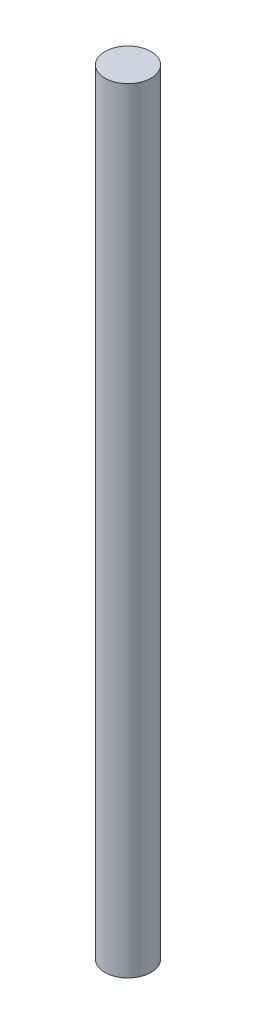
ISO-10303-21;
HEADER;
FILE_DESCRIPTION(('STEP AP214'),'2;1');
FILE_NAME('part.step','',(''),(''),'','','');
FILE_SCHEMA(('AUTOMOTIVE_DESIGN { 1 0 10303 214 1 1 1 1 }'));
ENDSEC;
DATA;
#1=APPLICATION_CONTEXT('core data for automotive mechanical design processes');
#2=APPLICATION_PROTOCOL_DEFINITION('international standard','automotive_design',2000,#1);
#3=PRODUCT_CONTEXT('',#1,'mechanical');
#4=PRODUCT('Part','Part','',(#3));
#5=PRODUCT_RELATED_PRODUCT_CATEGORY('part','',(#4));
#6=PRODUCT_DEFINITION_FORMATION('','',#4);
#7=PRODUCT_DEFINITION_CONTEXT('part definition',#1,'design');
#8=PRODUCT_DEFINITION('design','',#6,#7);
#9=PRODUCT_DEFINITION_SHAPE('','',#8);
#10=(LENGTH_UNIT() NAMED_UNIT(*) SI_UNIT(.MILLI.,.METRE.));
#11=(NAMED_UNIT(*) PLANE_ANGLE_UNIT() SI_UNIT($,.RADIAN.));
#12=(NAMED_UNIT(*) SI_UNIT($,.STERADIAN.) SOLID_ANGLE_UNIT());
#13=UNCERTAINTY_MEASURE_WITH_UNIT(LENGTH_MEASURE(1.E-05),#10,'distance_accuracy_value','');
#14=(GEOMETRIC_REPRESENTATION_CONTEXT(3) GLOBAL_UNCERTAINTY_ASSIGNED_CONTEXT((#13)) GLOBAL_UNIT_ASSIGNED_CONTEXT((#10,
#11,#12)) REPRESENTATION_CONTEXT('',''));
#15=CARTESIAN_POINT('',(0.,0.,0.));
#16=DIRECTION('',(0.,0.,1.));
#17=DIRECTION('',(1.,0.,0.));
#18=AXIS2_PLACEMENT_3D('',#15,#16,#17);
#19=CARTESIAN_POINT('',(0.,298.45,0.));
#20=DIRECTION('',(0.,-1.,0.));
#21=DIRECTION('',(0.,0.,-1.));
#22=AXIS2_PLACEMENT_3D('',#19,#20,#21);
#23=CYLINDRICAL_SURFACE('',#22,8.89);
#24=CARTESIAN_POINT('',(0.,298.45,0.));
#25=DIRECTION('',(0.,1.,0.));
#26=DIRECTION('',(0.,0.,1.));
#27=AXIS2_PLACEMENT_3D('',#24,#25,#26);
#28=CIRCLE('',#27,8.89);
#29=CARTESIAN_POINT('',(0.,298.45,8.89));
#30=VERTEX_POINT('',#29);
#31=EDGE_CURVE('E10',#30,#30,#28,.T.);
#32=ORIENTED_EDGE('',*,*,#31,.F.);
#33=EDGE_LOOP('',(#32));
#34=FACE_BOUND('',#33,.T.);
#35=CARTESIAN_POINT('',(0.,0.,0.));
#36=DIRECTION('',(0.,1.,0.));
#37=DIRECTION('',(0.,0.,1.));
#38=AXIS2_PLACEMENT_3D('',#35,#36,#37);
#39=CIRCLE('',#38,8.89);
#40=CARTESIAN_POINT('',(0.,0.,8.89));
#41=VERTEX_POINT('',#40);
#42=EDGE_CURVE('E38',#41,#41,#39,.T.);
#43=ORIENTED_EDGE('',*,*,#42,.T.);
#44=EDGE_LOOP('',(#43));
#45=FACE_BOUND('',#44,.T.);
#46=ADVANCED_FACE('F35',(#34,#45),#23,.T.);
#47=CARTESIAN_POINT('',(0.,298.45,0.));
#48=DIRECTION('',(0.,1.,0.));
#49=DIRECTION('',(0.,0.,1.));
#50=AXIS2_PLACEMENT_3D('',#47,#48,#49);
#51=PLANE('',#50);
#52=ORIENTED_EDGE('',*,*,#31,.T.);
#53=EDGE_LOOP('',(#52));
#54=FACE_BOUND('',#53,.T.);
#55=ADVANCED_FACE('F50',(#54),#51,.T.);
#56=CARTESIAN_POINT('',(0.,0.,0.));
#57=DIRECTION('',(0.,1.,0.));
#58=DIRECTION('',(0.,0.,1.));
#59=AXIS2_PLACEMENT_3D('',#56,#57,#58);
#60=PLANE('',#59);
#61=ORIENTED_EDGE('',*,*,#42,.F.);
#62=EDGE_LOOP('',(#61));
#63=FACE_BOUND('',#62,.T.);
#64=ADVANCED_FACE('F48',(#63),#60,.F.);
#65=CLOSED_SHELL('',(#46,#55,#64));
#66=MANIFOLD_SOLID_BREP('B2',#65);
#67=ADVANCED_BREP_SHAPE_REPRESENTATION('',(#18,#66),#14);
#68=SHAPE_DEFINITION_REPRESENTATION(#9,#67);
ENDSEC;
END-ISO-10303-21;
